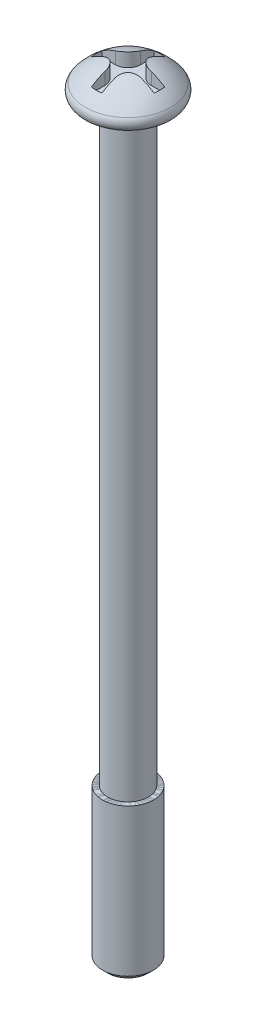
ISO-10303-21;
HEADER;
FILE_DESCRIPTION(('STEP AP214'),'2;1');
FILE_NAME('part.step','',(''),(''),'','','');
FILE_SCHEMA(('AUTOMOTIVE_DESIGN { 1 0 10303 214 1 1 1 1 }'));
ENDSEC;
DATA;
#1=APPLICATION_CONTEXT('core data for automotive mechanical design processes');
#2=APPLICATION_PROTOCOL_DEFINITION('international standard','automotive_design',2000,#1);
#3=PRODUCT_CONTEXT('',#1,'mechanical');
#4=PRODUCT('Part','Part','',(#3));
#5=PRODUCT_RELATED_PRODUCT_CATEGORY('part','',(#4));
#6=PRODUCT_DEFINITION_FORMATION('','',#4);
#7=PRODUCT_DEFINITION_CONTEXT('part definition',#1,'design');
#8=PRODUCT_DEFINITION('design','',#6,#7);
#9=PRODUCT_DEFINITION_SHAPE('','',#8);
#10=(LENGTH_UNIT() NAMED_UNIT(*) SI_UNIT(.MILLI.,.METRE.));
#11=(NAMED_UNIT(*) PLANE_ANGLE_UNIT() SI_UNIT($,.RADIAN.));
#12=(NAMED_UNIT(*) SI_UNIT($,.STERADIAN.) SOLID_ANGLE_UNIT());
#13=UNCERTAINTY_MEASURE_WITH_UNIT(LENGTH_MEASURE(1.E-05),#10,'distance_accuracy_value','');
#14=(GEOMETRIC_REPRESENTATION_CONTEXT(3) GLOBAL_UNCERTAINTY_ASSIGNED_CONTEXT((#13)) GLOBAL_UNIT_ASSIGNED_CONTEXT((#10,
#11,#12)) REPRESENTATION_CONTEXT('',''));
#15=CARTESIAN_POINT('',(0.,0.,0.));
#16=DIRECTION('',(0.,0.,1.));
#17=DIRECTION('',(1.,0.,0.));
#18=AXIS2_PLACEMENT_3D('',#15,#16,#17);
#19=CARTESIAN_POINT('',(0.,-29.5,0.));
#20=DIRECTION('',(0.,-1.,0.));
#21=DIRECTION('',(1.,0.,0.));
#22=AXIS2_PLACEMENT_3D('',#19,#20,#21);
#23=CYLINDRICAL_SURFACE('',#22,0.8);
#24=CARTESIAN_POINT('',(0.,-23.5,0.));
#25=DIRECTION('',(0.,-1.,0.));
#26=DIRECTION('',(0.,0.,-1.));
#27=AXIS2_PLACEMENT_3D('',#24,#25,#26);
#28=CIRCLE('',#27,0.8);
#29=CARTESIAN_POINT('',(0.,-23.5,-0.8));
#30=VERTEX_POINT('',#29);
#31=EDGE_CURVE('P0_E21',#30,#30,#28,.T.);
#32=ORIENTED_EDGE('',*,*,#31,.T.);
#33=EDGE_LOOP('',(#32));
#34=FACE_BOUND('',#33,.T.);
#35=CARTESIAN_POINT('',(0.,-29.5,0.));
#36=DIRECTION('',(0.,-1.,0.));
#37=DIRECTION('',(0.,0.,-1.));
#38=AXIS2_PLACEMENT_3D('',#35,#36,#37);
#39=CIRCLE('',#38,0.8);
#40=CARTESIAN_POINT('',(0.,-29.5,-0.8));
#41=VERTEX_POINT('',#40);
#42=EDGE_CURVE('P0_E11',#41,#41,#39,.F.);
#43=ORIENTED_EDGE('',*,*,#42,.T.);
#44=EDGE_LOOP('',(#43));
#45=FACE_BOUND('',#44,.T.);
#46=ADVANCED_FACE('P0_F17',(#34,#45),#23,.T.);
#47=CARTESIAN_POINT('',(0.,-23.5,0.));
#48=DIRECTION('',(0.,-1.,0.));
#49=DIRECTION('',(0.,0.,-1.));
#50=AXIS2_PLACEMENT_3D('',#47,#48,#49);
#51=PLANE('',#50);
#52=ORIENTED_EDGE('',*,*,#31,.F.);
#53=EDGE_LOOP('',(#52));
#54=FACE_BOUND('',#53,.T.);
#55=CARTESIAN_POINT('',(-1.,-23.5,0.));
#56=CARTESIAN_POINT('',(-1.,-23.5,-0.198626106562923));
#57=CARTESIAN_POINT('',(-0.923879532511287,-23.5,-0.38268343236509));
#58=CARTESIAN_POINT('',(-0.848070358486243,-23.5,-0.565988058606248));
#59=CARTESIAN_POINT('',(-0.707106781186548,-23.5,-0.707106781186548));
#60=CARTESIAN_POINT('',(-0.566920593389836,-23.5,-0.847447258664745));
#61=CARTESIAN_POINT('',(-0.382683432365091,-23.5,-0.923879532511287));
#62=CARTESIAN_POINT('',(-0.19946230709778,-23.5,-0.999890295720027));
#63=CARTESIAN_POINT('',(0.,-23.5,-1.));
#64=CARTESIAN_POINT('',(0.198362307319598,-23.5,-1.00010909928003));
#65=CARTESIAN_POINT('',(0.38268343236509,-23.5,-0.923879532511287));
#66=CARTESIAN_POINT('',(0.565988058606326,-23.5,-0.848070358486183));
#67=CARTESIAN_POINT('',(0.707106781186547,-23.5,-0.707106781186548));
#68=CARTESIAN_POINT('',(0.847447258664759,-23.5,-0.566920593389803));
#69=CARTESIAN_POINT('',(0.923879532511287,-23.5,-0.382683432365091));
#70=CARTESIAN_POINT('',(1.,-23.5,-0.199197869000137));
#71=CARTESIAN_POINT('',(1.,-23.5,0.));
#72=B_SPLINE_CURVE_WITH_KNOTS('',2,(#55,#56,#57,#58,#59,#60,#61,#62,#63,#64,#65,#66,#67,#68,#69,
#70,#71),.UNSPECIFIED.,.F.,.F.,(3,2,2,2,2,2,2,2,3),(0.,0.125,0.25,0.375,0.5,0.625,0.75,0.875,
1.),.UNSPECIFIED.);
#73=CARTESIAN_POINT('',(-1.,-23.5,0.));
#74=VERTEX_POINT('',#73);
#75=CARTESIAN_POINT('',(1.,-23.5,0.));
#76=VERTEX_POINT('',#75);
#77=EDGE_CURVE('P0_E33',#74,#76,#72,.T.);
#78=ORIENTED_EDGE('',*,*,#77,.T.);
#79=CARTESIAN_POINT('',(1.,-23.5,0.));
#80=CARTESIAN_POINT('',(1.,-23.5,0.198626106562923));
#81=CARTESIAN_POINT('',(0.923879532511287,-23.5,0.38268343236509));
#82=CARTESIAN_POINT('',(0.848070358486243,-23.5,0.565988058606248));
#83=CARTESIAN_POINT('',(0.707106781186548,-23.5,0.707106781186548));
#84=CARTESIAN_POINT('',(0.566920593389836,-23.5,0.847447258664745));
#85=CARTESIAN_POINT('',(0.382683432365091,-23.5,0.923879532511287));
#86=CARTESIAN_POINT('',(0.19946230709778,-23.5,0.999890295720027));
#87=CARTESIAN_POINT('',(0.,-23.5,1.));
#88=CARTESIAN_POINT('',(-0.198362307319598,-23.5,1.00010909928003));
#89=CARTESIAN_POINT('',(-0.38268343236509,-23.5,0.923879532511287));
#90=CARTESIAN_POINT('',(-0.565988058606326,-23.5,0.848070358486183));
#91=CARTESIAN_POINT('',(-0.707106781186547,-23.5,0.707106781186548));
#92=CARTESIAN_POINT('',(-0.847447258664759,-23.5,0.566920593389803));
#93=CARTESIAN_POINT('',(-0.923879532511287,-23.5,0.382683432365091));
#94=CARTESIAN_POINT('',(-1.,-23.5,0.199197869000137));
#95=CARTESIAN_POINT('',(-1.,-23.5,0.));
#96=B_SPLINE_CURVE_WITH_KNOTS('',2,(#79,#80,#81,#82,#83,#84,#85,#86,#87,#88,#89,#90,#91,#92,#93,
#94,#95),.UNSPECIFIED.,.F.,.F.,(3,2,2,2,2,2,2,2,3),(0.,0.125,0.25,0.375,0.5,0.625,0.75,0.875,
1.),.UNSPECIFIED.);
#97=EDGE_CURVE('P0_E35',#76,#74,#96,.T.);
#98=ORIENTED_EDGE('',*,*,#97,.T.);
#99=EDGE_LOOP('',(#78,#98));
#100=FACE_BOUND('',#99,.T.);
#101=ADVANCED_FACE('P0_F18',(#54,#100),#51,.T.);
#102=OPEN_SHELL('',(#46,#101));
#103=SHELL_BASED_SURFACE_MODEL('P0_B1',(#102));
#104=CARTESIAN_POINT('',(-0.7071067811865,0.6,0.7071067811865));
#105=DIRECTION('',(0.,-1.,0.));
#106=DIRECTION('',(1.,0.,0.));
#107=AXIS2_PLACEMENT_3D('',#104,#105,#106);
#108=CYLINDRICAL_SURFACE('',#107,0.5);
#109=DIRECTION('',(0.,1.,0.));
#110=VECTOR('',#109,1.);
#111=CARTESIAN_POINT('',(-0.2071067811865,0.6,0.7071067811865));
#112=LINE('',#111,#110);
#113=CARTESIAN_POINT('',(-0.2071067811865,0.6,0.7071067811865));
#114=VERTEX_POINT('',#113);
#115=CARTESIAN_POINT('',(-0.2071067811865,1.07294640094406,0.707106781186498));
#116=VERTEX_POINT('',#115);
#117=EDGE_CURVE('P1_E11',#114,#116,#112,.T.);
#118=ORIENTED_EDGE('',*,*,#117,.F.);
#119=CARTESIAN_POINT('',(-0.7071067811865,0.6,0.7071067811865));
#120=DIRECTION('',(0.,1.,0.));
#121=DIRECTION('',(1.,0.,0.));
#122=AXIS2_PLACEMENT_3D('',#119,#120,#121);
#123=CIRCLE('',#122,0.5);
#124=CARTESIAN_POINT('',(-0.7071067811865,0.6,0.2071067811865));
#125=VERTEX_POINT('',#124);
#126=EDGE_CURVE('P1_E308',#114,#125,#123,.T.);
#127=ORIENTED_EDGE('',*,*,#126,.T.);
#128=DIRECTION('',(0.,1.,0.));
#129=VECTOR('',#128,1.);
#130=CARTESIAN_POINT('',(-0.7071067811865,0.6,0.2071067811865));
#131=LINE('',#130,#129);
#132=CARTESIAN_POINT('',(-0.7071067811865,1.07294640094406,0.2071067811865));
#133=VERTEX_POINT('',#132);
#134=EDGE_CURVE('P1_E368',#125,#133,#131,.T.);
#135=ORIENTED_EDGE('',*,*,#134,.T.);
#136=CARTESIAN_POINT('',(-0.2071067811865,1.07294640094399,0.707106781186496));
#137=CARTESIAN_POINT('',(-0.20708107070802,1.08184940471506,0.681031989022164));
#138=CARTESIAN_POINT('',(-0.209146481401171,1.09007224663712,0.654692546970448));
#139=CARTESIAN_POINT('',(-0.2175213301955,1.10494901103184,0.602188992154356));
#140=CARTESIAN_POINT('',(-0.223839795046884,1.11159955578504,0.576025372092476));
#141=CARTESIAN_POINT('',(-0.240805286785179,1.12309832330567,0.524628448398488));
#142=CARTESIAN_POINT('',(-0.251463597981775,1.12794178396184,0.499397758525389));
#143=CARTESIAN_POINT('',(-0.2769148731271,1.13561433481563,0.450815594418322));
#144=CARTESIAN_POINT('',(-0.291702478653044,1.13844601885033,0.427461734938494));
#145=CARTESIAN_POINT('',(-0.324168110072707,1.1418982357399,0.384547163607269));
#146=CARTESIAN_POINT('',(-0.341659218000715,1.14262462779975,0.364853411307375));
#147=CARTESIAN_POINT('',(-0.379504040673062,1.14214198426932,0.328470924761213));
#148=CARTESIAN_POINT('',(-0.399857445595516,1.14093315800485,0.311781865724976));
#149=CARTESIAN_POINT('',(-0.44218194391931,1.13668742301589,0.282299244212277));
#150=CARTESIAN_POINT('',(-0.464091425949253,1.1337028949344,0.269409307195393));
#151=CARTESIAN_POINT('',(-0.509382307358199,1.12605007769953,0.247169360455419));
#152=CARTESIAN_POINT('',(-0.532764906858505,1.12138040065418,0.23782228168586));
#153=CARTESIAN_POINT('',(-0.581246319328969,1.11029411264287,0.222515292625005));
#154=CARTESIAN_POINT('',(-0.606376542321341,1.10381707995164,0.216699898873508));
#155=CARTESIAN_POINT('',(-0.656788055617933,1.08941622120876,0.208987388766629));
#156=CARTESIAN_POINT('',(-0.682069084305467,1.08149443909756,0.207084782946253));
#157=CARTESIAN_POINT('',(-0.707106781186496,1.07294640094399,0.2071067811865));
#158=B_SPLINE_CURVE_WITH_KNOTS('',3,(#136,#137,#138,#139,#140,#141,#142,#143,#144,#145,#146,
#147,#148,#149,#150,#151,#152,#153,#154,#155,#156,#157),.UNSPECIFIED.,.F.,.F.,(4,2,2,2,2,2,2,2,
2,2,4),(0.,0.0826176996166599,0.165411303583599,0.248421573324409,0.331324620523651,
0.409979952454392,0.488626777087194,0.565061260614399,0.641558839942775,0.721006340945886,
0.800342304439296),.UNSPECIFIED.);
#159=EDGE_CURVE('P1_E206',#116,#133,#158,.T.);
#160=ORIENTED_EDGE('',*,*,#159,.F.);
#161=EDGE_LOOP('',(#118,#127,#135,#160));
#162=FACE_BOUND('',#161,.T.);
#163=ADVANCED_FACE('P1_F17',(#162),#108,.T.);
#164=CARTESIAN_POINT('',(-0.2071067811865,0.6,1.232723318992));
#165=DIRECTION('',(-1.,0.,0.));
#166=DIRECTION('',(0.,0.,1.));
#167=AXIS2_PLACEMENT_3D('',#164,#165,#166);
#168=PLANE('',#167);
#169=DIRECTION('',(0.,1.,0.));
#170=VECTOR('',#169,1.);
#171=CARTESIAN_POINT('',(-0.2071067811865,0.6,1.232723318992));
#172=LINE('',#171,#170);
#173=CARTESIAN_POINT('',(-0.2071067811865,0.6,1.232723318992));
#174=VERTEX_POINT('',#173);
#175=CARTESIAN_POINT('',(-0.2071067811865,0.8103866990232,1.232723318992));
#176=VERTEX_POINT('',#175);
#177=EDGE_CURVE('P1_E35',#174,#176,#172,.T.);
#178=ORIENTED_EDGE('',*,*,#177,.F.);
#179=DIRECTION('',(0.,0.,-1.));
#180=VECTOR('',#179,1.);
#181=CARTESIAN_POINT('',(-0.2071067811865,0.6,1.232723318992));
#182=LINE('',#181,#180);
#183=EDGE_CURVE('P1_E290',#174,#114,#182,.T.);
#184=ORIENTED_EDGE('',*,*,#183,.T.);
#185=ORIENTED_EDGE('',*,*,#117,.T.);
#186=CARTESIAN_POINT('',(-0.2071067811865,-1.,0.));
#187=DIRECTION('',(-1.,0.,0.));
#188=DIRECTION('',(0.,0.826573841912762,0.562828289858974));
#189=AXIS2_PLACEMENT_3D('',#186,#187,#188);
#190=CIRCLE('',#189,2.190229846657);
#191=EDGE_CURVE('P1_E214',#176,#116,#190,.T.);
#192=ORIENTED_EDGE('',*,*,#191,.F.);
#193=EDGE_LOOP('',(#178,#184,#185,#192));
#194=FACE_BOUND('',#193,.T.);
#195=ADVANCED_FACE('P1_F273',(#194),#168,.F.);
#196=CARTESIAN_POINT('',(0.,0.6,0.));
#197=DIRECTION('',(0.,-1.,0.));
#198=DIRECTION('',(1.,0.,0.));
#199=AXIS2_PLACEMENT_3D('',#196,#197,#198);
#200=CYLINDRICAL_SURFACE('',#199,1.25);
#201=DIRECTION('',(0.,1.,0.));
#202=VECTOR('',#201,1.);
#203=CARTESIAN_POINT('',(0.2071067811865,0.6,1.232723318992));
#204=LINE('',#203,#202);
#205=CARTESIAN_POINT('',(0.2071067811865,0.6,1.232723318992));
#206=VERTEX_POINT('',#205);
#207=CARTESIAN_POINT('',(0.2071067811865,0.8103866990232,1.232723318992));
#208=VERTEX_POINT('',#207);
#209=EDGE_CURVE('P1_E293',#206,#208,#204,.T.);
#210=ORIENTED_EDGE('',*,*,#209,.F.);
#211=CARTESIAN_POINT('',(0.,0.6,0.));
#212=DIRECTION('',(0.,-1.,0.));
#213=DIRECTION('',(0.165685424949195,0.,0.986178655193573));
#214=AXIS2_PLACEMENT_3D('',#211,#212,#213);
#215=CIRCLE('',#214,1.25);
#216=EDGE_CURVE('P1_E296',#206,#174,#215,.T.);
#217=ORIENTED_EDGE('',*,*,#216,.T.);
#218=ORIENTED_EDGE('',*,*,#177,.T.);
#219=CARTESIAN_POINT('',(0.,0.8103866990232,0.));
#220=DIRECTION('',(0.,-1.,0.));
#221=DIRECTION('',(0.165685424949195,0.,0.986178655193573));
#222=AXIS2_PLACEMENT_3D('',#219,#220,#221);
#223=CIRCLE('',#222,1.25);
#224=EDGE_CURVE('P1_E364',#208,#176,#223,.T.);
#225=ORIENTED_EDGE('',*,*,#224,.F.);
#226=EDGE_LOOP('',(#210,#217,#218,#225));
#227=FACE_BOUND('',#226,.T.);
#228=ADVANCED_FACE('P1_F271',(#227),#200,.F.);
#229=CARTESIAN_POINT('',(0.2071067811865,0.6,0.7071067811865));
#230=DIRECTION('',(1.,0.,0.));
#231=DIRECTION('',(0.,1.,0.));
#232=AXIS2_PLACEMENT_3D('',#229,#230,#231);
#233=PLANE('',#232);
#234=DIRECTION('',(0.,1.,0.));
#235=VECTOR('',#234,1.);
#236=CARTESIAN_POINT('',(0.2071067811865,0.6,0.7071067811865));
#237=LINE('',#236,#235);
#238=CARTESIAN_POINT('',(0.2071067811865,0.6,0.7071067811865));
#239=VERTEX_POINT('',#238);
#240=CARTESIAN_POINT('',(0.2071067811865,1.07294640094406,0.7071067811865));
#241=VERTEX_POINT('',#240);
#242=EDGE_CURVE('P1_E374',#239,#241,#237,.T.);
#243=ORIENTED_EDGE('',*,*,#242,.F.);
#244=DIRECTION('',(0.,0.,1.));
#245=VECTOR('',#244,1.);
#246=CARTESIAN_POINT('',(0.2071067811865,0.6,0.7071067811865));
#247=LINE('',#246,#245);
#248=EDGE_CURVE('P1_E303',#239,#206,#247,.T.);
#249=ORIENTED_EDGE('',*,*,#248,.T.);
#250=ORIENTED_EDGE('',*,*,#209,.T.);
#251=CARTESIAN_POINT('',(0.2071067811865,-1.,0.));
#252=DIRECTION('',(1.,0.,0.));
#253=DIRECTION('',(0.,0.946451535261508,0.322845925173502));
#254=AXIS2_PLACEMENT_3D('',#251,#252,#253);
#255=CIRCLE('',#254,2.190229846657);
#256=EDGE_CURVE('P1_E382',#241,#208,#255,.T.);
#257=ORIENTED_EDGE('',*,*,#256,.F.);
#258=EDGE_LOOP('',(#243,#249,#250,#257));
#259=FACE_BOUND('',#258,.T.);
#260=ADVANCED_FACE('P1_F270',(#259),#233,.F.);
#261=CARTESIAN_POINT('',(0.7071067811865,0.6,0.7071067811865));
#262=DIRECTION('',(0.,-1.,0.));
#263=DIRECTION('',(1.,0.,0.));
#264=AXIS2_PLACEMENT_3D('',#261,#262,#263);
#265=CYLINDRICAL_SURFACE('',#264,0.5);
#266=DIRECTION('',(0.,1.,0.));
#267=VECTOR('',#266,1.);
#268=CARTESIAN_POINT('',(0.7071067811865,0.6,0.2071067811865));
#269=LINE('',#268,#267);
#270=CARTESIAN_POINT('',(0.7071067811865,0.6,0.2071067811865));
#271=VERTEX_POINT('',#270);
#272=CARTESIAN_POINT('',(0.707106781186498,1.07294640094406,0.2071067811865));
#273=VERTEX_POINT('',#272);
#274=EDGE_CURVE('P1_E375',#271,#273,#269,.T.);
#275=ORIENTED_EDGE('',*,*,#274,.F.);
#276=CARTESIAN_POINT('',(0.7071067811865,0.6,0.7071067811865));
#277=DIRECTION('',(0.,1.,0.));
#278=DIRECTION('',(0.,0.,-1.));
#279=AXIS2_PLACEMENT_3D('',#276,#277,#278);
#280=CIRCLE('',#279,0.5);
#281=EDGE_CURVE('P1_E320',#271,#239,#280,.T.);
#282=ORIENTED_EDGE('',*,*,#281,.T.);
#283=ORIENTED_EDGE('',*,*,#242,.T.);
#284=CARTESIAN_POINT('',(0.707106781186496,1.07294640094399,0.2071067811865));
#285=CARTESIAN_POINT('',(0.681031989022164,1.08184940471506,0.20708107070802));
#286=CARTESIAN_POINT('',(0.654692546970448,1.09007224663712,0.209146481401171));
#287=CARTESIAN_POINT('',(0.602188992154356,1.10494901103184,0.2175213301955));
#288=CARTESIAN_POINT('',(0.576025372092476,1.11159955578504,0.223839795046884));
#289=CARTESIAN_POINT('',(0.524628448398488,1.12309832330567,0.240805286785179));
#290=CARTESIAN_POINT('',(0.499397758525389,1.12794178396184,0.251463597981775));
#291=CARTESIAN_POINT('',(0.450815594418322,1.13561433481563,0.2769148731271));
#292=CARTESIAN_POINT('',(0.427461734938494,1.13844601885033,0.291702478653044));
#293=CARTESIAN_POINT('',(0.384547163607269,1.1418982357399,0.324168110072707));
#294=CARTESIAN_POINT('',(0.364853411307375,1.14262462779975,0.341659218000715));
#295=CARTESIAN_POINT('',(0.328470924761213,1.14214198426932,0.379504040673062));
#296=CARTESIAN_POINT('',(0.311781865724975,1.14093315800485,0.399857445595516));
#297=CARTESIAN_POINT('',(0.282299244212278,1.13668742301589,0.44218194391931));
#298=CARTESIAN_POINT('',(0.269409307195393,1.1337028949344,0.464091425949253));
#299=CARTESIAN_POINT('',(0.247169360455419,1.12605007769953,0.509382307358199));
#300=CARTESIAN_POINT('',(0.23782228168586,1.12138040065418,0.532764906858505));
#301=CARTESIAN_POINT('',(0.222515292625005,1.11029411264287,0.581246319328969));
#302=CARTESIAN_POINT('',(0.216699898873508,1.10381707995164,0.606376542321341));
#303=CARTESIAN_POINT('',(0.208987388766629,1.08941622120876,0.656788055617933));
#304=CARTESIAN_POINT('',(0.207084782946253,1.08149443909756,0.682069084305467));
#305=CARTESIAN_POINT('',(0.2071067811865,1.07294640094399,0.707106781186496));
#306=B_SPLINE_CURVE_WITH_KNOTS('',3,(#284,#285,#286,#287,#288,#289,#290,#291,#292,#293,#294,
#295,#296,#297,#298,#299,#300,#301,#302,#303,#304,#305),.UNSPECIFIED.,.F.,.F.,(4,2,2,2,2,2,2,2,
2,2,4),(0.,0.0826176996166599,0.165411303583599,0.248421573324409,0.331324620523651,
0.409979952454392,0.488626777087194,0.565061260614399,0.641558839942775,0.721006340945886,
0.800342304439296),.UNSPECIFIED.);
#307=EDGE_CURVE('P1_E216',#273,#241,#306,.T.);
#308=ORIENTED_EDGE('',*,*,#307,.F.);
#309=EDGE_LOOP('',(#275,#282,#283,#308));
#310=FACE_BOUND('',#309,.T.);
#311=ADVANCED_FACE('P1_F265',(#310),#265,.T.);
#312=CARTESIAN_POINT('',(1.232723318992,0.6,0.2071067811865));
#313=DIRECTION('',(0.,0.,1.));
#314=DIRECTION('',(1.,0.,0.));
#315=AXIS2_PLACEMENT_3D('',#312,#313,#314);
#316=PLANE('',#315);
#317=DIRECTION('',(0.,1.,0.));
#318=VECTOR('',#317,1.);
#319=CARTESIAN_POINT('',(1.232723318992,0.6,0.2071067811865));
#320=LINE('',#319,#318);
#321=CARTESIAN_POINT('',(1.232723318992,0.6,0.2071067811865));
#322=VERTEX_POINT('',#321);
#323=CARTESIAN_POINT('',(1.232723318992,0.8103866990232,0.2071067811865));
#324=VERTEX_POINT('',#323);
#325=EDGE_CURVE('P1_E312',#322,#324,#320,.T.);
#326=ORIENTED_EDGE('',*,*,#325,.F.);
#327=DIRECTION('',(-1.,0.,0.));
#328=VECTOR('',#327,1.);
#329=CARTESIAN_POINT('',(1.232723318992,0.6,0.2071067811865));
#330=LINE('',#329,#328);
#331=EDGE_CURVE('P1_E321',#322,#271,#330,.T.);
#332=ORIENTED_EDGE('',*,*,#331,.T.);
#333=ORIENTED_EDGE('',*,*,#274,.T.);
#334=CARTESIAN_POINT('',(0.,-1.,0.2071067811865));
#335=DIRECTION('',(0.,0.,1.));
#336=DIRECTION('',(0.562828289858974,0.826573841912762,0.));
#337=AXIS2_PLACEMENT_3D('',#334,#335,#336);
#338=CIRCLE('',#337,2.190229846657);
#339=EDGE_CURVE('P1_E376',#324,#273,#338,.T.);
#340=ORIENTED_EDGE('',*,*,#339,.F.);
#341=EDGE_LOOP('',(#326,#332,#333,#340));
#342=FACE_BOUND('',#341,.T.);
#343=ADVANCED_FACE('P1_F259',(#342),#316,.F.);
#344=CARTESIAN_POINT('',(0.,0.6,0.));
#345=DIRECTION('',(0.,-1.,0.));
#346=DIRECTION('',(1.,0.,0.));
#347=AXIS2_PLACEMENT_3D('',#344,#345,#346);
#348=CYLINDRICAL_SURFACE('',#347,1.25);
#349=CARTESIAN_POINT('',(0.,0.8103866990232,0.));
#350=DIRECTION('',(0.,-1.,0.));
#351=DIRECTION('',(0.986178655193573,0.,-0.165685424949195));
#352=AXIS2_PLACEMENT_3D('',#349,#350,#351);
#353=CIRCLE('',#352,1.25);
#354=CARTESIAN_POINT('',(1.232723318992,0.8103866990232,-0.2071067811865));
#355=VERTEX_POINT('',#354);
#356=EDGE_CURVE('P1_E395',#355,#324,#353,.T.);
#357=ORIENTED_EDGE('',*,*,#356,.F.);
#358=DIRECTION('',(0.,1.,0.));
#359=VECTOR('',#358,1.);
#360=CARTESIAN_POINT('',(1.232723318992,0.6,-0.2071067811865));
#361=LINE('',#360,#359);
#362=CARTESIAN_POINT('',(1.232723318992,0.6,-0.2071067811865));
#363=VERTEX_POINT('',#362);
#364=EDGE_CURVE('P1_E357',#363,#355,#361,.T.);
#365=ORIENTED_EDGE('',*,*,#364,.F.);
#366=CARTESIAN_POINT('',(0.,0.6,0.));
#367=DIRECTION('',(0.,-1.,0.));
#368=DIRECTION('',(0.986178655193573,0.,-0.165685424949195));
#369=AXIS2_PLACEMENT_3D('',#366,#367,#368);
#370=CIRCLE('',#369,1.25);
#371=EDGE_CURVE('P1_E324',#363,#322,#370,.T.);
#372=ORIENTED_EDGE('',*,*,#371,.T.);
#373=ORIENTED_EDGE('',*,*,#325,.T.);
#374=EDGE_LOOP('',(#357,#365,#372,#373));
#375=FACE_BOUND('',#374,.T.);
#376=ADVANCED_FACE('P1_F254',(#375),#348,.F.);
#377=CARTESIAN_POINT('',(0.7071067811865,0.6,-0.2071067811865));
#378=DIRECTION('',(0.,0.,-1.));
#379=DIRECTION('',(0.,-1.,0.));
#380=AXIS2_PLACEMENT_3D('',#377,#378,#379);
#381=PLANE('',#380);
#382=DIRECTION('',(0.,1.,0.));
#383=VECTOR('',#382,1.);
#384=CARTESIAN_POINT('',(0.7071067811865,0.6,-0.2071067811865));
#385=LINE('',#384,#383);
#386=CARTESIAN_POINT('',(0.7071067811865,0.6,-0.2071067811865));
#387=VERTEX_POINT('',#386);
#388=CARTESIAN_POINT('',(0.7071067811865,1.07294640094406,-0.2071067811865));
#389=VERTEX_POINT('',#388);
#390=EDGE_CURVE('P1_E363',#387,#389,#385,.T.);
#391=ORIENTED_EDGE('',*,*,#390,.F.);
#392=DIRECTION('',(1.,0.,0.));
#393=VECTOR('',#392,1.);
#394=CARTESIAN_POINT('',(0.7071067811865,0.6,-0.2071067811865));
#395=LINE('',#394,#393);
#396=EDGE_CURVE('P1_E328',#387,#363,#395,.T.);
#397=ORIENTED_EDGE('',*,*,#396,.T.);
#398=ORIENTED_EDGE('',*,*,#364,.T.);
#399=CARTESIAN_POINT('',(0.,-1.,-0.2071067811865));
#400=DIRECTION('',(0.,0.,-1.));
#401=DIRECTION('',(0.322845925173502,0.946451535261508,0.));
#402=AXIS2_PLACEMENT_3D('',#399,#400,#401);
#403=CIRCLE('',#402,2.190229846657);
#404=EDGE_CURVE('P1_E245',#389,#355,#403,.T.);
#405=ORIENTED_EDGE('',*,*,#404,.F.);
#406=EDGE_LOOP('',(#391,#397,#398,#405));
#407=FACE_BOUND('',#406,.T.);
#408=ADVANCED_FACE('P1_F249',(#407),#381,.F.);
#409=CARTESIAN_POINT('',(0.7071067811865,0.6,-0.7071067811865));
#410=DIRECTION('',(0.,-1.,0.));
#411=DIRECTION('',(1.,0.,0.));
#412=AXIS2_PLACEMENT_3D('',#409,#410,#411);
#413=CYLINDRICAL_SURFACE('',#412,0.5);
#414=DIRECTION('',(0.,1.,0.));
#415=VECTOR('',#414,1.);
#416=CARTESIAN_POINT('',(0.2071067811865,0.6,-0.7071067811865));
#417=LINE('',#416,#415);
#418=CARTESIAN_POINT('',(0.2071067811865,0.6,-0.7071067811865));
#419=VERTEX_POINT('',#418);
#420=CARTESIAN_POINT('',(0.2071067811865,1.07294640094406,-0.707106781186498));
#421=VERTEX_POINT('',#420);
#422=EDGE_CURVE('P1_E356',#419,#421,#417,.T.);
#423=ORIENTED_EDGE('',*,*,#422,.F.);
#424=CARTESIAN_POINT('',(0.7071067811865,0.6,-0.7071067811865));
#425=DIRECTION('',(0.,1.,0.));
#426=DIRECTION('',(-1.,0.,0.));
#427=AXIS2_PLACEMENT_3D('',#424,#425,#426);
#428=CIRCLE('',#427,0.5);
#429=EDGE_CURVE('P1_E334',#419,#387,#428,.T.);
#430=ORIENTED_EDGE('',*,*,#429,.T.);
#431=ORIENTED_EDGE('',*,*,#390,.T.);
#432=CARTESIAN_POINT('',(0.2071067811865,1.07294640094399,-0.707106781186496));
#433=CARTESIAN_POINT('',(0.20708107070802,1.08184940471506,-0.681031989022164));
#434=CARTESIAN_POINT('',(0.209146481401171,1.09007224663712,-0.654692546970448));
#435=CARTESIAN_POINT('',(0.2175213301955,1.10494901103184,-0.602188992154356));
#436=CARTESIAN_POINT('',(0.223839795046884,1.11159955578504,-0.576025372092476));
#437=CARTESIAN_POINT('',(0.240805286785179,1.12309832330567,-0.524628448398488));
#438=CARTESIAN_POINT('',(0.251463597981775,1.12794178396184,-0.499397758525389));
#439=CARTESIAN_POINT('',(0.2769148731271,1.13561433481563,-0.450815594418322));
#440=CARTESIAN_POINT('',(0.291702478653044,1.13844601885033,-0.427461734938494));
#441=CARTESIAN_POINT('',(0.324168110072707,1.1418982357399,-0.384547163607269));
#442=CARTESIAN_POINT('',(0.341659218000715,1.14262462779975,-0.364853411307375));
#443=CARTESIAN_POINT('',(0.379504040673062,1.14214198426932,-0.328470924761213));
#444=CARTESIAN_POINT('',(0.399857445595516,1.14093315800485,-0.311781865724976));
#445=CARTESIAN_POINT('',(0.44218194391931,1.13668742301589,-0.282299244212277));
#446=CARTESIAN_POINT('',(0.464091425949253,1.1337028949344,-0.269409307195393));
#447=CARTESIAN_POINT('',(0.509382307358199,1.12605007769953,-0.247169360455419));
#448=CARTESIAN_POINT('',(0.532764906858505,1.12138040065418,-0.23782228168586));
#449=CARTESIAN_POINT('',(0.581246319328969,1.11029411264287,-0.222515292625005));
#450=CARTESIAN_POINT('',(0.606376542321341,1.10381707995164,-0.216699898873508));
#451=CARTESIAN_POINT('',(0.656788055617933,1.08941622120876,-0.208987388766629));
#452=CARTESIAN_POINT('',(0.682069084305467,1.08149443909756,-0.207084782946253));
#453=CARTESIAN_POINT('',(0.707106781186496,1.07294640094399,-0.2071067811865));
#454=B_SPLINE_CURVE_WITH_KNOTS('',3,(#432,#433,#434,#435,#436,#437,#438,#439,#440,#441,#442,
#443,#444,#445,#446,#447,#448,#449,#450,#451,#452,#453),.UNSPECIFIED.,.F.,.F.,(4,2,2,2,2,2,2,2,
2,2,4),(0.,0.0826176996166599,0.165411303583599,0.248421573324409,0.331324620523651,
0.409979952454392,0.488626777087194,0.565061260614399,0.641558839942775,0.721006340945886,
0.800342304439296),.UNSPECIFIED.);
#455=EDGE_CURVE('P1_E234',#421,#389,#454,.T.);
#456=ORIENTED_EDGE('',*,*,#455,.F.);
#457=EDGE_LOOP('',(#423,#430,#431,#456));
#458=FACE_BOUND('',#457,.T.);
#459=ADVANCED_FACE('P1_F243',(#458),#413,.T.);
#460=CARTESIAN_POINT('',(0.2071067811865,0.6,-1.232723318992));
#461=DIRECTION('',(1.,0.,0.));
#462=DIRECTION('',(0.,1.,0.));
#463=AXIS2_PLACEMENT_3D('',#460,#461,#462);
#464=PLANE('',#463);
#465=DIRECTION('',(0.,1.,0.));
#466=VECTOR('',#465,1.);
#467=CARTESIAN_POINT('',(0.2071067811865,0.6,-1.232723318992));
#468=LINE('',#467,#466);
#469=CARTESIAN_POINT('',(0.2071067811865,0.6,-1.232723318992));
#470=VERTEX_POINT('',#469);
#471=CARTESIAN_POINT('',(0.2071067811865,0.8103866990232,-1.232723318992));
#472=VERTEX_POINT('',#471);
#473=EDGE_CURVE('P1_E354',#470,#472,#468,.T.);
#474=ORIENTED_EDGE('',*,*,#473,.F.);
#475=DIRECTION('',(0.,0.,1.));
#476=VECTOR('',#475,1.);
#477=CARTESIAN_POINT('',(0.2071067811865,0.6,-1.232723318992));
#478=LINE('',#477,#476);
#479=EDGE_CURVE('P1_E337',#470,#419,#478,.T.);
#480=ORIENTED_EDGE('',*,*,#479,.T.);
#481=ORIENTED_EDGE('',*,*,#422,.T.);
#482=CARTESIAN_POINT('',(0.2071067811865,-1.,0.));
#483=DIRECTION('',(1.,0.,0.));
#484=DIRECTION('',(0.,0.826573841912762,-0.562828289858974));
#485=AXIS2_PLACEMENT_3D('',#482,#483,#484);
#486=CIRCLE('',#485,2.190229846657);
#487=EDGE_CURVE('P1_E242',#472,#421,#486,.T.);
#488=ORIENTED_EDGE('',*,*,#487,.F.);
#489=EDGE_LOOP('',(#474,#480,#481,#488));
#490=FACE_BOUND('',#489,.T.);
#491=ADVANCED_FACE('P1_F247',(#490),#464,.F.);
#492=CARTESIAN_POINT('',(0.,0.6,0.));
#493=DIRECTION('',(0.,-1.,0.));
#494=DIRECTION('',(1.,0.,0.));
#495=AXIS2_PLACEMENT_3D('',#492,#493,#494);
#496=CYLINDRICAL_SURFACE('',#495,1.25);
#497=DIRECTION('',(0.,1.,0.));
#498=VECTOR('',#497,1.);
#499=CARTESIAN_POINT('',(-0.2071067811865,0.6,-1.232723318992));
#500=LINE('',#499,#498);
#501=CARTESIAN_POINT('',(-0.2071067811865,0.6,-1.232723318992));
#502=VERTEX_POINT('',#501);
#503=CARTESIAN_POINT('',(-0.2071067811865,0.8103866990232,-1.232723318992));
#504=VERTEX_POINT('',#503);
#505=EDGE_CURVE('P1_E180',#502,#504,#500,.T.);
#506=ORIENTED_EDGE('',*,*,#505,.F.);
#507=CARTESIAN_POINT('',(0.,0.6,0.));
#508=DIRECTION('',(0.,-1.,0.));
#509=DIRECTION('',(-0.165685424949195,0.,-0.986178655193573));
#510=AXIS2_PLACEMENT_3D('',#507,#508,#509);
#511=CIRCLE('',#510,1.25);
#512=EDGE_CURVE('P1_E342',#502,#470,#511,.T.);
#513=ORIENTED_EDGE('',*,*,#512,.T.);
#514=ORIENTED_EDGE('',*,*,#473,.T.);
#515=CARTESIAN_POINT('',(0.,0.8103866990232,0.));
#516=DIRECTION('',(0.,-1.,0.));
#517=DIRECTION('',(-0.165685424949195,0.,-0.986178655193573));
#518=AXIS2_PLACEMENT_3D('',#515,#516,#517);
#519=CIRCLE('',#518,1.25);
#520=EDGE_CURVE('P1_E186',#504,#472,#519,.T.);
#521=ORIENTED_EDGE('',*,*,#520,.F.);
#522=EDGE_LOOP('',(#506,#513,#514,#521));
#523=FACE_BOUND('',#522,.T.);
#524=ADVANCED_FACE('P1_F611',(#523),#496,.F.);
#525=CARTESIAN_POINT('',(-0.2071067811865,0.6,-0.7071067811865));
#526=DIRECTION('',(-1.,0.,0.));
#527=DIRECTION('',(0.,0.,1.));
#528=AXIS2_PLACEMENT_3D('',#525,#526,#527);
#529=PLANE('',#528);
#530=DIRECTION('',(0.,1.,0.));
#531=VECTOR('',#530,1.);
#532=CARTESIAN_POINT('',(-0.2071067811865,0.6,-0.7071067811865));
#533=LINE('',#532,#531);
#534=CARTESIAN_POINT('',(-0.2071067811865,0.6,-0.7071067811865));
#535=VERTEX_POINT('',#534);
#536=CARTESIAN_POINT('',(-0.2071067811865,1.07294640094406,-0.7071067811865));
#537=VERTEX_POINT('',#536);
#538=EDGE_CURVE('P1_E167',#535,#537,#533,.T.);
#539=ORIENTED_EDGE('',*,*,#538,.F.);
#540=DIRECTION('',(0.,0.,-1.));
#541=VECTOR('',#540,1.);
#542=CARTESIAN_POINT('',(-0.2071067811865,0.6,-0.7071067811865));
#543=LINE('',#542,#541);
#544=EDGE_CURVE('P1_E343',#535,#502,#543,.T.);
#545=ORIENTED_EDGE('',*,*,#544,.T.);
#546=ORIENTED_EDGE('',*,*,#505,.T.);
#547=CARTESIAN_POINT('',(-0.2071067811865,-1.,0.));
#548=DIRECTION('',(-1.,0.,0.));
#549=DIRECTION('',(0.,0.946451535261508,-0.322845925173502));
#550=AXIS2_PLACEMENT_3D('',#547,#548,#549);
#551=CIRCLE('',#550,2.190229846657);
#552=EDGE_CURVE('P1_E178',#537,#504,#551,.T.);
#553=ORIENTED_EDGE('',*,*,#552,.F.);
#554=EDGE_LOOP('',(#539,#545,#546,#553));
#555=FACE_BOUND('',#554,.T.);
#556=ADVANCED_FACE('P1_F185',(#555),#529,.F.);
#557=CARTESIAN_POINT('',(-0.7071067811865,0.6,-0.7071067811865));
#558=DIRECTION('',(0.,-1.,0.));
#559=DIRECTION('',(1.,0.,0.));
#560=AXIS2_PLACEMENT_3D('',#557,#558,#559);
#561=CYLINDRICAL_SURFACE('',#560,0.5);
#562=DIRECTION('',(0.,1.,0.));
#563=VECTOR('',#562,1.);
#564=CARTESIAN_POINT('',(-0.7071067811865,0.6,-0.2071067811865));
#565=LINE('',#564,#563);
#566=CARTESIAN_POINT('',(-0.7071067811865,0.6,-0.2071067811865));
#567=VERTEX_POINT('',#566);
#568=CARTESIAN_POINT('',(-0.707106781186498,1.07294640094406,-0.2071067811865));
#569=VERTEX_POINT('',#568);
#570=EDGE_CURVE('P1_E48',#567,#569,#565,.T.);
#571=ORIENTED_EDGE('',*,*,#570,.F.);
#572=CARTESIAN_POINT('',(-0.7071067811865,0.6,-0.7071067811865));
#573=DIRECTION('',(0.,1.,0.));
#574=DIRECTION('',(0.,0.,1.));
#575=AXIS2_PLACEMENT_3D('',#572,#573,#574);
#576=CIRCLE('',#575,0.5);
#577=EDGE_CURVE('P1_E172',#567,#535,#576,.T.);
#578=ORIENTED_EDGE('',*,*,#577,.T.);
#579=ORIENTED_EDGE('',*,*,#538,.T.);
#580=CARTESIAN_POINT('',(-0.707106781186496,1.07294640094399,-0.2071067811865));
#581=CARTESIAN_POINT('',(-0.681031989022164,1.08184940471506,-0.20708107070802));
#582=CARTESIAN_POINT('',(-0.654692546970448,1.09007224663712,-0.209146481401171));
#583=CARTESIAN_POINT('',(-0.602188992154356,1.10494901103184,-0.2175213301955));
#584=CARTESIAN_POINT('',(-0.576025372092476,1.11159955578504,-0.223839795046884));
#585=CARTESIAN_POINT('',(-0.524628448398488,1.12309832330567,-0.240805286785179));
#586=CARTESIAN_POINT('',(-0.499397758525389,1.12794178396184,-0.251463597981775));
#587=CARTESIAN_POINT('',(-0.450815594418322,1.13561433481563,-0.2769148731271));
#588=CARTESIAN_POINT('',(-0.427461734938494,1.13844601885033,-0.291702478653044));
#589=CARTESIAN_POINT('',(-0.384547163607269,1.1418982357399,-0.324168110072707));
#590=CARTESIAN_POINT('',(-0.364853411307375,1.14262462779975,-0.341659218000715));
#591=CARTESIAN_POINT('',(-0.328470924761213,1.14214198426932,-0.379504040673062));
#592=CARTESIAN_POINT('',(-0.311781865724975,1.14093315800485,-0.399857445595516));
#593=CARTESIAN_POINT('',(-0.282299244212278,1.13668742301589,-0.44218194391931));
#594=CARTESIAN_POINT('',(-0.269409307195393,1.1337028949344,-0.464091425949253));
#595=CARTESIAN_POINT('',(-0.247169360455419,1.12605007769953,-0.509382307358199));
#596=CARTESIAN_POINT('',(-0.23782228168586,1.12138040065418,-0.532764906858505));
#597=CARTESIAN_POINT('',(-0.222515292625005,1.11029411264287,-0.581246319328969));
#598=CARTESIAN_POINT('',(-0.216699898873508,1.10381707995164,-0.606376542321341));
#599=CARTESIAN_POINT('',(-0.208987388766629,1.08941622120876,-0.656788055617933));
#600=CARTESIAN_POINT('',(-0.207084782946253,1.08149443909756,-0.682069084305467));
#601=CARTESIAN_POINT('',(-0.2071067811865,1.07294640094399,-0.707106781186496));
#602=B_SPLINE_CURVE_WITH_KNOTS('',3,(#580,#581,#582,#583,#584,#585,#586,#587,#588,#589,#590,
#591,#592,#593,#594,#595,#596,#597,#598,#599,#600,#601),.UNSPECIFIED.,.F.,.F.,(4,2,2,2,2,2,2,2,
2,2,4),(0.,0.0826176996166599,0.165411303583599,0.248421573324409,0.331324620523651,
0.409979952454392,0.488626777087194,0.565061260614399,0.641558839942775,0.721006340945886,
0.800342304439296),.UNSPECIFIED.);
#603=EDGE_CURVE('P1_E21',#569,#537,#602,.T.);
#604=ORIENTED_EDGE('',*,*,#603,.F.);
#605=EDGE_LOOP('',(#571,#578,#579,#604));
#606=FACE_BOUND('',#605,.T.);
#607=ADVANCED_FACE('P1_F169',(#606),#561,.T.);
#608=CARTESIAN_POINT('',(-1.232723318992,0.6,-0.2071067811865));
#609=DIRECTION('',(0.,0.,-1.));
#610=DIRECTION('',(0.,-1.,0.));
#611=AXIS2_PLACEMENT_3D('',#608,#609,#610);
#612=PLANE('',#611);
#613=DIRECTION('',(0.,1.,0.));
#614=VECTOR('',#613,1.);
#615=CARTESIAN_POINT('',(-1.232723318992,0.6,-0.2071067811865));
#616=LINE('',#615,#614);
#617=CARTESIAN_POINT('',(-1.232723318992,0.6,-0.2071067811865));
#618=VERTEX_POINT('',#617);
#619=CARTESIAN_POINT('',(-1.232723318992,0.8103866990232,-0.2071067811865));
#620=VERTEX_POINT('',#619);
#621=EDGE_CURVE('P1_E379',#618,#620,#616,.T.);
#622=ORIENTED_EDGE('',*,*,#621,.F.);
#623=DIRECTION('',(1.,0.,0.));
#624=VECTOR('',#623,1.);
#625=CARTESIAN_POINT('',(-1.232723318992,0.6,-0.2071067811865));
#626=LINE('',#625,#624);
#627=EDGE_CURVE('P1_E349',#618,#567,#626,.T.);
#628=ORIENTED_EDGE('',*,*,#627,.T.);
#629=ORIENTED_EDGE('',*,*,#570,.T.);
#630=CARTESIAN_POINT('',(0.,-1.,-0.2071067811865));
#631=DIRECTION('',(0.,0.,-1.));
#632=DIRECTION('',(-0.562828289858974,0.826573841912762,0.));
#633=AXIS2_PLACEMENT_3D('',#630,#631,#632);
#634=CIRCLE('',#633,2.190229846657);
#635=EDGE_CURVE('P1_E193',#620,#569,#634,.T.);
#636=ORIENTED_EDGE('',*,*,#635,.F.);
#637=EDGE_LOOP('',(#622,#628,#629,#636));
#638=FACE_BOUND('',#637,.T.);
#639=ADVANCED_FACE('P1_F587',(#638),#612,.F.);
#640=CARTESIAN_POINT('',(0.,0.6,0.));
#641=DIRECTION('',(0.,-1.,0.));
#642=DIRECTION('',(0.,0.,-1.));
#643=AXIS2_PLACEMENT_3D('',#640,#641,#642);
#644=PLANE('',#643);
#645=ORIENTED_EDGE('',*,*,#126,.F.);
#646=ORIENTED_EDGE('',*,*,#183,.F.);
#647=ORIENTED_EDGE('',*,*,#216,.F.);
#648=ORIENTED_EDGE('',*,*,#248,.F.);
#649=ORIENTED_EDGE('',*,*,#281,.F.);
#650=ORIENTED_EDGE('',*,*,#331,.F.);
#651=ORIENTED_EDGE('',*,*,#371,.F.);
#652=ORIENTED_EDGE('',*,*,#396,.F.);
#653=ORIENTED_EDGE('',*,*,#429,.F.);
#654=ORIENTED_EDGE('',*,*,#479,.F.);
#655=ORIENTED_EDGE('',*,*,#512,.F.);
#656=ORIENTED_EDGE('',*,*,#544,.F.);
#657=ORIENTED_EDGE('',*,*,#577,.F.);
#658=ORIENTED_EDGE('',*,*,#627,.F.);
#659=CARTESIAN_POINT('',(0.,0.6,0.));
#660=DIRECTION('',(0.,-1.,0.));
#661=DIRECTION('',(-0.986178655193573,0.,0.165685424949195));
#662=AXIS2_PLACEMENT_3D('',#659,#660,#661);
#663=CIRCLE('',#662,1.25);
#664=CARTESIAN_POINT('',(-1.232723318992,0.6,0.2071067811865));
#665=VERTEX_POINT('',#664);
#666=EDGE_CURVE('P1_E414',#665,#618,#663,.T.);
#667=ORIENTED_EDGE('',*,*,#666,.F.);
#668=DIRECTION('',(-1.,0.,0.));
#669=VECTOR('',#668,1.);
#670=CARTESIAN_POINT('',(-0.7071067811865,0.6,0.2071067811865));
#671=LINE('',#670,#669);
#672=EDGE_CURVE('P1_E315',#125,#665,#671,.T.);
#673=ORIENTED_EDGE('',*,*,#672,.F.);
#674=EDGE_LOOP('',(#645,#646,#647,#648,#649,#650,#651,#652,#653,#654,#655,#656,#657,#658,#667,#673));
#675=FACE_BOUND('',#674,.T.);
#676=ADVANCED_FACE('P1_F301',(#675),#644,.F.);
#677=CARTESIAN_POINT('',(-0.7071067811865,0.6,0.2071067811865));
#678=DIRECTION('',(0.,0.,1.));
#679=DIRECTION('',(1.,0.,0.));
#680=AXIS2_PLACEMENT_3D('',#677,#678,#679);
#681=PLANE('',#680);
#682=ORIENTED_EDGE('',*,*,#134,.F.);
#683=ORIENTED_EDGE('',*,*,#672,.T.);
#684=DIRECTION('',(0.,1.,0.));
#685=VECTOR('',#684,1.);
#686=CARTESIAN_POINT('',(-1.232723318992,0.6,0.2071067811865));
#687=LINE('',#686,#685);
#688=CARTESIAN_POINT('',(-1.232723318992,0.8103866990232,0.2071067811865));
#689=VERTEX_POINT('',#688);
#690=EDGE_CURVE('P1_E410',#665,#689,#687,.T.);
#691=ORIENTED_EDGE('',*,*,#690,.T.);
#692=CARTESIAN_POINT('',(0.,-1.,0.2071067811865));
#693=DIRECTION('',(0.,0.,1.));
#694=DIRECTION('',(-0.322845925173502,0.946451535261508,0.));
#695=AXIS2_PLACEMENT_3D('',#692,#693,#694);
#696=CIRCLE('',#695,2.190229846657);
#697=EDGE_CURVE('P1_E212',#133,#689,#696,.T.);
#698=ORIENTED_EDGE('',*,*,#697,.F.);
#699=EDGE_LOOP('',(#682,#683,#691,#698));
#700=FACE_BOUND('',#699,.T.);
#701=ADVANCED_FACE('P1_F428',(#700),#681,.F.);
#702=CARTESIAN_POINT('',(0.,0.6,0.));
#703=DIRECTION('',(0.,-1.,0.));
#704=DIRECTION('',(1.,0.,0.));
#705=AXIS2_PLACEMENT_3D('',#702,#703,#704);
#706=CYLINDRICAL_SURFACE('',#705,1.25);
#707=ORIENTED_EDGE('',*,*,#690,.F.);
#708=ORIENTED_EDGE('',*,*,#666,.T.);
#709=ORIENTED_EDGE('',*,*,#621,.T.);
#710=CARTESIAN_POINT('',(0.,0.8103866990232,0.));
#711=DIRECTION('',(0.,-1.,0.));
#712=DIRECTION('',(-1.,0.,0.));
#713=AXIS2_PLACEMENT_3D('',#710,#711,#712);
#714=CIRCLE('',#713,1.25);
#715=EDGE_CURVE('P1_E405',#689,#620,#714,.T.);
#716=ORIENTED_EDGE('',*,*,#715,.F.);
#717=EDGE_LOOP('',(#707,#708,#709,#716));
#718=FACE_BOUND('',#717,.T.);
#719=ADVANCED_FACE('P1_F227',(#718),#706,.F.);
#720=CARTESIAN_POINT('',(0.,-1.,0.));
#721=DIRECTION('',(0.,-1.,0.));
#722=DIRECTION('',(-1.,0.,0.));
#723=AXIS2_PLACEMENT_3D('',#720,#721,#722);
#724=SPHERICAL_SURFACE('',#723,2.2);
#725=ORIENTED_EDGE('',*,*,#356,.T.);
#726=ORIENTED_EDGE('',*,*,#339,.T.);
#727=ORIENTED_EDGE('',*,*,#307,.T.);
#728=ORIENTED_EDGE('',*,*,#256,.T.);
#729=ORIENTED_EDGE('',*,*,#224,.T.);
#730=ORIENTED_EDGE('',*,*,#191,.T.);
#731=ORIENTED_EDGE('',*,*,#159,.T.);
#732=ORIENTED_EDGE('',*,*,#697,.T.);
#733=ORIENTED_EDGE('',*,*,#715,.T.);
#734=ORIENTED_EDGE('',*,*,#635,.T.);
#735=ORIENTED_EDGE('',*,*,#603,.T.);
#736=ORIENTED_EDGE('',*,*,#552,.T.);
#737=ORIENTED_EDGE('',*,*,#520,.T.);
#738=ORIENTED_EDGE('',*,*,#487,.T.);
#739=ORIENTED_EDGE('',*,*,#455,.T.);
#740=ORIENTED_EDGE('',*,*,#404,.T.);
#741=EDGE_LOOP('',(#725,#726,#727,#728,#729,#730,#731,#732,#733,#734,#735,#736,#737,#738,#739,#740));
#742=FACE_BOUND('',#741,.T.);
#743=CARTESIAN_POINT('',(0.,0.432108774042,0.));
#744=DIRECTION('',(0.,-1.,0.));
#745=DIRECTION('',(1.,0.,0.));
#746=AXIS2_PLACEMENT_3D('',#743,#744,#745);
#747=CIRCLE('',#746,1.670049238589);
#748=CARTESIAN_POINT('',(1.670049238589,0.432108774042,0.));
#749=VERTEX_POINT('',#748);
#750=EDGE_CURVE('P1_E194',#749,#749,#747,.T.);
#751=ORIENTED_EDGE('',*,*,#750,.F.);
#752=EDGE_LOOP('',(#751));
#753=FACE_BOUND('',#752,.T.);
#754=ADVANCED_FACE('P1_F187',(#742,#753),#724,.T.);
#755=CARTESIAN_POINT('',(0.,0.216054387021,0.));
#756=DIRECTION('',(0.,-1.,0.));
#757=DIRECTION('',(-1.,0.,0.));
#758=AXIS2_PLACEMENT_3D('',#755,#756,#757);
#759=TOROIDAL_SURFACE('',#758,1.418098080214,0.3319019197855);
#760=ORIENTED_EDGE('',*,*,#750,.T.);
#761=EDGE_LOOP('',(#760));
#762=FACE_BOUND('',#761,.T.);
#763=CARTESIAN_POINT('',(0.,0.,0.));
#764=DIRECTION('',(0.,1.,0.));
#765=DIRECTION('',(1.,0.,0.));
#766=AXIS2_PLACEMENT_3D('',#763,#764,#765);
#767=CIRCLE('',#766,1.670049238589);
#768=CARTESIAN_POINT('',(1.670049238589,0.,0.));
#769=VERTEX_POINT('',#768);
#770=EDGE_CURVE('P1_E203',#769,#769,#767,.T.);
#771=ORIENTED_EDGE('',*,*,#770,.T.);
#772=EDGE_LOOP('',(#771));
#773=FACE_BOUND('',#772,.T.);
#774=ADVANCED_FACE('P1_F226',(#762,#773),#759,.T.);
#775=CARTESIAN_POINT('',(0.,0.,0.));
#776=DIRECTION('',(0.,-1.,0.));
#777=DIRECTION('',(0.,0.,-1.));
#778=AXIS2_PLACEMENT_3D('',#775,#776,#777);
#779=PLANE('',#778);
#780=CARTESIAN_POINT('',(0.,0.,0.));
#781=DIRECTION('',(0.,1.,0.));
#782=DIRECTION('',(0.,0.,1.));
#783=AXIS2_PLACEMENT_3D('',#780,#781,#782);
#784=CIRCLE('',#783,0.8);
#785=CARTESIAN_POINT('',(0.,0.,0.8));
#786=VERTEX_POINT('',#785);
#787=EDGE_CURVE('P1_E460',#786,#786,#784,.T.);
#788=ORIENTED_EDGE('',*,*,#787,.T.);
#789=EDGE_LOOP('',(#788));
#790=FACE_BOUND('',#789,.T.);
#791=ORIENTED_EDGE('',*,*,#770,.F.);
#792=EDGE_LOOP('',(#791));
#793=FACE_BOUND('',#792,.T.);
#794=ADVANCED_FACE('P1_F229',(#790,#793),#779,.T.);
#795=CARTESIAN_POINT('',(0.,1.175,0.));
#796=DIRECTION('',(0.,-1.,0.));
#797=DIRECTION('',(0.,0.,1.));
#798=AXIS2_PLACEMENT_3D('',#795,#796,#797);
#799=CYLINDRICAL_SURFACE('',#798,0.8);
#800=ORIENTED_EDGE('',*,*,#787,.F.);
#801=EDGE_LOOP('',(#800));
#802=FACE_BOUND('',#801,.T.);
#803=CARTESIAN_POINT('',(0.,-23.5,0.));
#804=DIRECTION('',(0.,-1.,0.));
#805=DIRECTION('',(0.,0.,1.));
#806=AXIS2_PLACEMENT_3D('',#803,#804,#805);
#807=CIRCLE('',#806,0.8);
#808=CARTESIAN_POINT('',(0.,-23.5,0.8));
#809=VERTEX_POINT('',#808);
#810=EDGE_CURVE('P1_E459',#809,#809,#807,.T.);
#811=ORIENTED_EDGE('',*,*,#810,.F.);
#812=EDGE_LOOP('',(#811));
#813=FACE_BOUND('',#812,.T.);
#814=ADVANCED_FACE('P1_F482',(#802,#813),#799,.T.);
#815=CARTESIAN_POINT('',(0.,-23.5,0.));
#816=DIRECTION('',(0.,-1.,0.));
#817=DIRECTION('',(0.,0.,-1.));
#818=AXIS2_PLACEMENT_3D('',#815,#816,#817);
#819=PLANE('',#818);
#820=ORIENTED_EDGE('',*,*,#810,.T.);
#821=EDGE_LOOP('',(#820));
#822=FACE_BOUND('',#821,.T.);
#823=CARTESIAN_POINT('',(0.,-23.5,0.));
#824=DIRECTION('',(0.,1.,0.));
#825=DIRECTION('',(-1.,0.,0.));
#826=AXIS2_PLACEMENT_3D('',#823,#824,#825);
#827=CIRCLE('',#826,1.);
#828=CARTESIAN_POINT('',(-1.,-23.5,0.));
#829=VERTEX_POINT('',#828);
#830=EDGE_CURVE('P1_E461',#829,#829,#827,.T.);
#831=ORIENTED_EDGE('',*,*,#830,.T.);
#832=EDGE_LOOP('',(#831));
#833=FACE_BOUND('',#832,.T.);
#834=ADVANCED_FACE('P1_F481',(#822,#833),#819,.F.);
#835=CARTESIAN_POINT('',(0.,2.735,0.));
#836=DIRECTION('',(0.,-1.,0.));
#837=DIRECTION('',(-1.,0.,0.));
#838=AXIS2_PLACEMENT_3D('',#835,#836,#837);
#839=CYLINDRICAL_SURFACE('',#838,1.);
#840=ORIENTED_EDGE('',*,*,#830,.F.);
#841=EDGE_LOOP('',(#840));
#842=FACE_BOUND('',#841,.T.);
#843=CARTESIAN_POINT('',(0.,-29.3,0.));
#844=DIRECTION('',(0.,-1.,0.));
#845=DIRECTION('',(-1.,0.,0.));
#846=AXIS2_PLACEMENT_3D('',#843,#844,#845);
#847=CIRCLE('',#846,1.);
#848=CARTESIAN_POINT('',(-1.,-29.3,0.));
#849=VERTEX_POINT('',#848);
#850=EDGE_CURVE('P1_E464',#849,#849,#847,.T.);
#851=ORIENTED_EDGE('',*,*,#850,.F.);
#852=EDGE_LOOP('',(#851));
#853=FACE_BOUND('',#852,.T.);
#854=ADVANCED_FACE('P1_F491',(#842,#853),#839,.T.);
#855=CARTESIAN_POINT('',(0.,-29.4,0.));
#856=DIRECTION('',(0.,1.,0.));
#857=DIRECTION('',(1.,0.,0.));
#858=AXIS2_PLACEMENT_3D('',#855,#856,#857);
#859=CONICAL_SURFACE('',#858,0.9,0.7853981633973);
#860=CARTESIAN_POINT('',(0.,-29.5,0.));
#861=DIRECTION('',(0.,1.,0.));
#862=DIRECTION('',(-1.,0.,0.));
#863=AXIS2_PLACEMENT_3D('',#860,#861,#862);
#864=CIRCLE('',#863,0.8);
#865=CARTESIAN_POINT('',(-0.8,-29.5,0.));
#866=VERTEX_POINT('',#865);
#867=EDGE_CURVE('P1_E473',#866,#866,#864,.T.);
#868=ORIENTED_EDGE('',*,*,#867,.T.);
#869=EDGE_LOOP('',(#868));
#870=FACE_BOUND('',#869,.T.);
#871=ORIENTED_EDGE('',*,*,#850,.T.);
#872=EDGE_LOOP('',(#871));
#873=FACE_BOUND('',#872,.T.);
#874=ADVANCED_FACE('P1_F500',(#870,#873),#859,.T.);
#875=CARTESIAN_POINT('',(0.,-29.5,0.));
#876=DIRECTION('',(0.,-1.,0.));
#877=DIRECTION('',(0.,0.,-1.));
#878=AXIS2_PLACEMENT_3D('',#875,#876,#877);
#879=PLANE('',#878);
#880=ORIENTED_EDGE('',*,*,#867,.F.);
#881=EDGE_LOOP('',(#880));
#882=FACE_BOUND('',#881,.T.);
#883=ADVANCED_FACE('P1_F502',(#882),#879,.T.);
#884=CLOSED_SHELL('',(#163,#195,#228,#260,#311,#343,#376,#408,#459,#491,#524,#556,#607,#639,
#676,#701,#719,#754,#774,#794,#814,#834,#854,#874,#883));
#885=MANIFOLD_SOLID_BREP('P1_B1',#884);
#886=ADVANCED_BREP_SHAPE_REPRESENTATION('',(#18,#885),#14);
#887=MANIFOLD_SURFACE_SHAPE_REPRESENTATION('',(#18,#103),#14);
#888=SHAPE_REPRESENTATION('',(#18),#14);
#889=SHAPE_DEFINITION_REPRESENTATION(#9,#888);
#890=SHAPE_REPRESENTATION_RELATIONSHIP('','',#888,#886);
#891=SHAPE_REPRESENTATION_RELATIONSHIP('','',#888,#887);
ENDSEC;
END-ISO-10303-21;
